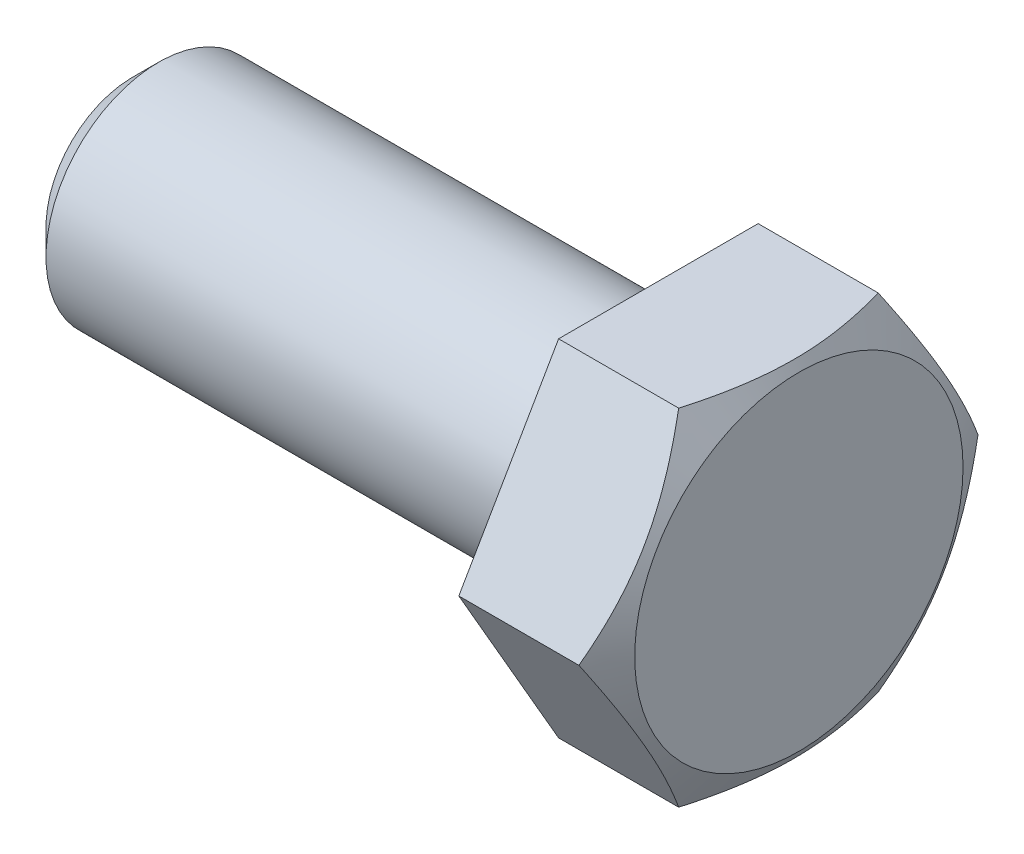
ISO-10303-21;
HEADER;
FILE_DESCRIPTION(('STEP AP214'),'2;1');
FILE_NAME('part.step','',(''),(''),'','','');
FILE_SCHEMA(('AUTOMOTIVE_DESIGN { 1 0 10303 214 1 1 1 1 }'));
ENDSEC;
DATA;
#1=APPLICATION_CONTEXT('core data for automotive mechanical design processes');
#2=APPLICATION_PROTOCOL_DEFINITION('international standard','automotive_design',2000,#1);
#3=PRODUCT_CONTEXT('',#1,'mechanical');
#4=PRODUCT('Part','Part','',(#3));
#5=PRODUCT_RELATED_PRODUCT_CATEGORY('part','',(#4));
#6=PRODUCT_DEFINITION_FORMATION('','',#4);
#7=PRODUCT_DEFINITION_CONTEXT('part definition',#1,'design');
#8=PRODUCT_DEFINITION('design','',#6,#7);
#9=PRODUCT_DEFINITION_SHAPE('','',#8);
#10=(LENGTH_UNIT() NAMED_UNIT(*) SI_UNIT(.MILLI.,.METRE.));
#11=(NAMED_UNIT(*) PLANE_ANGLE_UNIT() SI_UNIT($,.RADIAN.));
#12=(NAMED_UNIT(*) SI_UNIT($,.STERADIAN.) SOLID_ANGLE_UNIT());
#13=UNCERTAINTY_MEASURE_WITH_UNIT(LENGTH_MEASURE(1.E-05),#10,'distance_accuracy_value','');
#14=(GEOMETRIC_REPRESENTATION_CONTEXT(3) GLOBAL_UNCERTAINTY_ASSIGNED_CONTEXT((#13)) GLOBAL_UNIT_ASSIGNED_CONTEXT((#10,
#11,#12)) REPRESENTATION_CONTEXT('',''));
#15=CARTESIAN_POINT('',(0.,0.,0.));
#16=DIRECTION('',(0.,0.,1.));
#17=DIRECTION('',(1.,0.,0.));
#18=AXIS2_PLACEMENT_3D('',#15,#16,#17);
#19=CARTESIAN_POINT('',(18.7,-23.,-13.2790561913614));
#20=DIRECTION('',(0.,0.5,0.866025403784439));
#21=DIRECTION('',(0.,-0.866025403784439,0.5));
#22=AXIS2_PLACEMENT_3D('',#19,#20,#21);
#23=PLANE('',#22);
#24=DIRECTION('',(-1.,0.,0.));
#25=VECTOR('',#24,1.);
#26=CARTESIAN_POINT('',(18.7,0.,-26.5581123827228));
#27=LINE('',#26,#25);
#28=CARTESIAN_POINT('',(15.98177004846,0.,-26.5581123827228));
#29=VERTEX_POINT('',#28);
#30=CARTESIAN_POINT('',(0.,0.,-26.5581123827228));
#31=VERTEX_POINT('',#30);
#32=EDGE_CURVE('E102',#29,#31,#27,.T.);
#33=ORIENTED_EDGE('',*,*,#32,.F.);
#34=CARTESIAN_POINT('',(15.9817033813586,0.000200000000008834,-26.5582278527766));
#35=CARTESIAN_POINT('',(16.1502011985481,-0.505330062673204,-26.2663599350088));
#36=CARTESIAN_POINT('',(16.3110527987376,-1.01283196178729,-25.973353576941));
#37=CARTESIAN_POINT('',(16.6153381972535,-2.03190531689706,-25.3849913010444));
#38=CARTESIAN_POINT('',(16.7587662669133,-2.5434780527506,-25.0896346442893));
#39=CARTESIAN_POINT('',(17.0262794649299,-3.57169268257136,-24.4959946509776));
#40=CARTESIAN_POINT('',(17.150318401199,-4.08834365645311,-24.1977060721299));
#41=CARTESIAN_POINT('',(17.3763812476432,-5.12521364262296,-23.5990689065001));
#42=CARTESIAN_POINT('',(17.4784073509189,-5.64543229413633,-23.2987205280114));
#43=CARTESIAN_POINT('',(17.6561136735018,-6.67614041497859,-22.7036409169872));
#44=CARTESIAN_POINT('',(17.7323815673877,-7.18655343138033,-22.4089538245697));
#45=CARTESIAN_POINT('',(17.8602654373196,-8.20971821625924,-21.8182293605946));
#46=CARTESIAN_POINT('',(17.9118809388424,-8.72247002956312,-21.5221919631561));
#47=CARTESIAN_POINT('',(17.9891567585064,-9.74883498195347,-20.9296198816067));
#48=CARTESIAN_POINT('',(18.0148479188244,-10.262446367649,-20.6330862098166));
#49=CARTESIAN_POINT('',(18.0397225737895,-11.290143110363,-20.0397452187653));
#50=CARTESIAN_POINT('',(18.0389068875491,-11.8042284522445,-19.7429379082436));
#51=CARTESIAN_POINT('',(18.0126192180329,-12.7653194926008,-19.1880517373782));
#52=CARTESIAN_POINT('',(17.9903527841641,-13.2123936406372,-18.9299333576616));
#53=CARTESIAN_POINT('',(17.9261954988025,-14.1054746057766,-18.4143128220302));
#54=CARTESIAN_POINT('',(17.8843049283877,-14.551481438075,-18.1568106573424));
#55=CARTESIAN_POINT('',(17.7816253785011,-15.4422629858203,-17.6425176909625));
#56=CARTESIAN_POINT('',(17.7208193097279,-15.8870362186836,-17.3857277452405));
#57=CARTESIAN_POINT('',(17.5813849288372,-16.7744530307106,-16.8733774099333));
#58=CARTESIAN_POINT('',(17.502756692231,-17.2170966188894,-16.6178170151432));
#59=CARTESIAN_POINT('',(17.2381208571077,-18.5608682942346,-15.8419900766533));
#60=CARTESIAN_POINT('',(17.0257116981298,-19.4581784847056,-15.3239277966383));
#61=CARTESIAN_POINT('',(16.6640950700395,-20.7942343191446,-14.5525556009725));
#62=CARTESIAN_POINT('',(16.5365191724387,-21.2375518433277,-14.2966061090489));
#63=CARTESIAN_POINT('',(16.2684518903369,-22.1211205248807,-13.7864774929068));
#64=CARTESIAN_POINT('',(16.1279641460901,-22.5613725090964,-13.5322978913086));
#65=CARTESIAN_POINT('',(15.9817033813586,-23.0002,-13.2789407213076));
#66=B_SPLINE_CURVE_WITH_KNOTS('',3,(#34,#35,#36,#37,#38,#39,#40,#41,#42,#43,#44,#45,#46,#47,#48,
#49,#50,#51,#52,#53,#54,#55,#56,#57,#58,#59,#60,#61,#62,#63,#64,#65),.UNSPECIFIED.,.F.,.F.,(4,2,
2,2,2,2,2,2,2,2,2,2,2,2,2,4),(0.,1.82275209583971,3.64610187987773,5.47373144334343,
7.30117883905958,9.08355891739022,10.8659733025976,12.6462646412199,14.4265009654718,
15.9762768881921,17.5260306140232,19.0771885590146,20.6283399319781,23.7989683744784,
25.381520854309,26.9636285236953),.UNSPECIFIED.);
#67=CARTESIAN_POINT('',(15.98177004846,-23.,-13.2790561913614));
#68=VERTEX_POINT('',#67);
#69=EDGE_CURVE('E89',#29,#68,#66,.T.);
#70=ORIENTED_EDGE('',*,*,#69,.T.);
#71=DIRECTION('',(-1.,0.,0.));
#72=VECTOR('',#71,1.);
#73=CARTESIAN_POINT('',(18.7,-23.,-13.2790561913614));
#74=LINE('',#73,#72);
#75=CARTESIAN_POINT('',(0.,-23.,-13.2790561913614));
#76=VERTEX_POINT('',#75);
#77=EDGE_CURVE('E60',#68,#76,#74,.T.);
#78=ORIENTED_EDGE('',*,*,#77,.T.);
#79=DIRECTION('',(0.,0.866025403784439,-0.5));
#80=VECTOR('',#79,1.);
#81=CARTESIAN_POINT('',(0.,-23.,-13.2790561913614));
#82=LINE('',#81,#80);
#83=EDGE_CURVE('E108',#76,#31,#82,.T.);
#84=ORIENTED_EDGE('',*,*,#83,.T.);
#85=EDGE_LOOP('',(#33,#70,#78,#84));
#86=FACE_BOUND('',#85,.T.);
#87=ADVANCED_FACE('F37',(#86),#23,.F.);
#88=CARTESIAN_POINT('',(18.7,0.,-26.5581123827228));
#89=DIRECTION('',(0.,-0.5,0.866025403784439));
#90=DIRECTION('',(0.,-0.866025403784439,-0.5));
#91=AXIS2_PLACEMENT_3D('',#88,#89,#90);
#92=PLANE('',#91);
#93=DIRECTION('',(-1.,0.,0.));
#94=VECTOR('',#93,1.);
#95=CARTESIAN_POINT('',(18.7,23.,-13.2790561913614));
#96=LINE('',#95,#94);
#97=CARTESIAN_POINT('',(15.98177004846,23.,-13.2790561913614));
#98=VERTEX_POINT('',#97);
#99=CARTESIAN_POINT('',(0.,23.,-13.2790561913614));
#100=VERTEX_POINT('',#99);
#101=EDGE_CURVE('E104',#98,#100,#96,.T.);
#102=ORIENTED_EDGE('',*,*,#101,.F.);
#103=CARTESIAN_POINT('',(15.9817033813586,23.0002,-13.2789407213076));
#104=CARTESIAN_POINT('',(16.1502011985481,22.4946699373268,-13.5708086390754));
#105=CARTESIAN_POINT('',(16.3110527987376,21.9871680382127,-13.8638149971432));
#106=CARTESIAN_POINT('',(16.6153381972535,20.9680946831029,-14.4521772730398));
#107=CARTESIAN_POINT('',(16.7587662669133,20.4565219472494,-14.7475339297949));
#108=CARTESIAN_POINT('',(17.0262794649299,19.4283073174286,-15.3411739231066));
#109=CARTESIAN_POINT('',(17.150318401199,18.9116563435469,-15.6394625019543));
#110=CARTESIAN_POINT('',(17.3763812476432,17.874786357377,-16.2380996675841));
#111=CARTESIAN_POINT('',(17.4784073509189,17.3545677058637,-16.5384480460728));
#112=CARTESIAN_POINT('',(17.6561136735018,16.3238595850214,-17.133527657097));
#113=CARTESIAN_POINT('',(17.7323815673877,15.8134465686197,-17.4282147495145));
#114=CARTESIAN_POINT('',(17.8602654373196,14.7902817837408,-18.0189392134897));
#115=CARTESIAN_POINT('',(17.9118809388424,14.2775299704369,-18.3149766109281));
#116=CARTESIAN_POINT('',(17.9891567585064,13.2511650180465,-18.9075486924775));
#117=CARTESIAN_POINT('',(18.0148479188244,12.737553632351,-19.2040823642677));
#118=CARTESIAN_POINT('',(18.0397225737894,11.709856889637,-19.7974233553189));
#119=CARTESIAN_POINT('',(18.0389068875491,11.1957715477555,-20.0942306658406));
#120=CARTESIAN_POINT('',(18.0126192180329,10.2346805073992,-20.649116836706));
#121=CARTESIAN_POINT('',(17.9903527841641,9.78760635936283,-20.9072352164226));
#122=CARTESIAN_POINT('',(17.9261954988025,8.89452539422337,-21.422855752054));
#123=CARTESIAN_POINT('',(17.8843049283877,8.44851856192502,-21.6803579167418));
#124=CARTESIAN_POINT('',(17.7816253785011,7.5577370141797,-22.1946508831218));
#125=CARTESIAN_POINT('',(17.7208193097279,7.1129637813164,-22.4514408288437));
#126=CARTESIAN_POINT('',(17.5813849288372,6.22554696928939,-22.9637911641509));
#127=CARTESIAN_POINT('',(17.502756692231,5.78290338111064,-23.219351558941));
#128=CARTESIAN_POINT('',(17.2381208571076,4.43913170576542,-23.9951784974309));
#129=CARTESIAN_POINT('',(17.0257116981298,3.54182151529443,-24.513240777446));
#130=CARTESIAN_POINT('',(16.6640950700395,2.20576568085546,-25.2846129731117));
#131=CARTESIAN_POINT('',(16.5365191724387,1.76244815667234,-25.5405624650353));
#132=CARTESIAN_POINT('',(16.2684518903369,0.878879475119307,-26.0506910811774));
#133=CARTESIAN_POINT('',(16.1279641460901,0.438627490903595,-26.3048706827756));
#134=CARTESIAN_POINT('',(15.9817033813586,-0.000199999999991352,-26.5582278527766));
#135=B_SPLINE_CURVE_WITH_KNOTS('',3,(#103,#104,#105,#106,#107,#108,#109,#110,#111,#112,#113,
#114,#115,#116,#117,#118,#119,#120,#121,#122,#123,#124,#125,#126,#127,#128,#129,#130,#131,#132,
#133,#134),.UNSPECIFIED.,.F.,.F.,(4,2,2,2,2,2,2,2,2,2,2,2,2,2,2,4),(0.,1.82275209583971,
3.64610187987773,5.47373144334344,7.30117883905958,9.08355891739021,10.8659733025976,
12.6462646412199,14.4265009654718,15.9762768881921,17.5260306140232,19.0771885590146,
20.6283399319781,23.7989683744784,25.381520854309,26.9636285236953),.UNSPECIFIED.);
#136=EDGE_CURVE('E92',#98,#29,#135,.T.);
#137=ORIENTED_EDGE('',*,*,#136,.T.);
#138=ORIENTED_EDGE('',*,*,#32,.T.);
#139=DIRECTION('',(0.,0.866025403784438,0.5));
#140=VECTOR('',#139,1.);
#141=CARTESIAN_POINT('',(0.,0.,-26.5581123827228));
#142=LINE('',#141,#140);
#143=EDGE_CURVE('E131',#31,#100,#142,.T.);
#144=ORIENTED_EDGE('',*,*,#143,.T.);
#145=EDGE_LOOP('',(#102,#137,#138,#144));
#146=FACE_BOUND('',#145,.T.);
#147=ADVANCED_FACE('F100',(#146),#92,.F.);
#148=CARTESIAN_POINT('',(18.7,23.,-13.2790561913614));
#149=DIRECTION('',(0.,-1.,0.));
#150=DIRECTION('',(0.,0.,-1.));
#151=AXIS2_PLACEMENT_3D('',#148,#149,#150);
#152=PLANE('',#151);
#153=DIRECTION('',(-1.,0.,0.));
#154=VECTOR('',#153,1.);
#155=CARTESIAN_POINT('',(18.7,23.,13.2790561913614));
#156=LINE('',#155,#154);
#157=CARTESIAN_POINT('',(15.98177004846,23.,13.2790561913614));
#158=VERTEX_POINT('',#157);
#159=CARTESIAN_POINT('',(0.,23.,13.2790561913614));
#160=VERTEX_POINT('',#159);
#161=EDGE_CURVE('E111',#158,#160,#156,.T.);
#162=ORIENTED_EDGE('',*,*,#161,.F.);
#163=CARTESIAN_POINT('',(7.07439166605425,23.,-35.1260062269643));
#164=CARTESIAN_POINT('',(7.31808519038506,23.,-34.6214667244443));
#165=CARTESIAN_POINT('',(7.5605137491192,23.,-34.116314357186));
#166=CARTESIAN_POINT('',(8.04254214626597,23.,-33.1046552605516));
#167=CARTESIAN_POINT('',(8.28214195325279,23.,-32.5981485162058));
#168=CARTESIAN_POINT('',(8.75824943613874,23.,-31.5835762806856));
#169=CARTESIAN_POINT('',(8.99475657497651,23.,-31.0755105372085));
#170=CARTESIAN_POINT('',(9.46427584940225,23.,-30.0577694951503));
#171=CARTESIAN_POINT('',(9.69728799396989,23.,-29.5480942007086));
#172=CARTESIAN_POINT('',(10.3931661877172,23.,-28.0105312709745));
#173=CARTESIAN_POINT('',(10.8501195396296,23.,-26.979953395623));
#174=CARTESIAN_POINT('',(11.7442762938602,23.,-24.9103007042642));
#175=CARTESIAN_POINT('',(12.181480732735,23.,-23.8712263375991));
#176=CARTESIAN_POINT('',(13.0358825389817,23.,-21.7704504579267));
#177=CARTESIAN_POINT('',(13.4527810728399,23.,-20.7086267462517));
#178=CARTESIAN_POINT('',(14.2536979553438,23.,-18.572415460692));
#179=CARTESIAN_POINT('',(14.637712638227,23.,-17.4980265012166));
#180=CARTESIAN_POINT('',(15.3624708838141,23.,-15.3372480271595));
#181=CARTESIAN_POINT('',(15.7033072526952,23.,-14.2508899001616));
#182=CARTESIAN_POINT('',(16.3305965267326,23.,-12.0626288622898));
#183=CARTESIAN_POINT('',(16.6170667066952,23.,-10.9607310091094));
#184=CARTESIAN_POINT('',(16.9954702044003,23.,-9.29601346187074));
#185=CARTESIAN_POINT('',(17.1130770281649,23.,-8.7389906320123));
#186=CARTESIAN_POINT('',(17.3293210074896,23.,-7.62125639085807));
#187=CARTESIAN_POINT('',(17.4279585944305,23.,-7.06054506374262));
#188=CARTESIAN_POINT('',(17.6045101916899,23.,-5.9358169045642));
#189=CARTESIAN_POINT('',(17.6824229068822,23.,-5.37179986817274));
#190=CARTESIAN_POINT('',(17.8159568382735,23.,-4.24111394992035));
#191=CARTESIAN_POINT('',(17.8715780258803,23.,-3.67444506465897));
#192=CARTESIAN_POINT('',(17.9590364509718,23.,-2.54282548942751));
#193=CARTESIAN_POINT('',(17.9910201531806,23.,-1.97788619339113));
#194=CARTESIAN_POINT('',(18.031036841926,23.,-0.847162886914948));
#195=CARTESIAN_POINT('',(18.0390701873603,23.,-0.28137888926017));
#196=CARTESIAN_POINT('',(18.0309961658223,23.,0.849864513398281));
#197=CARTESIAN_POINT('',(18.0148953788774,23.,1.41532396484198));
#198=CARTESIAN_POINT('',(17.9589504878202,23.,2.54507106745939));
#199=CARTESIAN_POINT('',(17.9191053366815,23.,3.10935866585814));
#200=CARTESIAN_POINT('',(17.7943517575055,23.,4.47956459390397));
#201=CARTESIAN_POINT('',(17.6974054557474,23.,5.28440464320615));
#202=CARTESIAN_POINT('',(17.4606240084475,23.,6.88775937710742));
#203=CARTESIAN_POINT('',(17.3207824198766,23.,7.68627309297204));
#204=CARTESIAN_POINT('',(17.0029689246414,23.,9.27740159057656));
#205=CARTESIAN_POINT('',(16.8249151254118,23.,10.069999859334));
#206=CARTESIAN_POINT('',(16.4362015474096,23.,11.647052386795));
#207=CARTESIAN_POINT('',(16.2255430134296,23.,12.4315069551914));
#208=CARTESIAN_POINT('',(15.7714264081023,23.,14.0106174830527));
#209=CARTESIAN_POINT('',(15.5273184978228,23.,14.8050852920603));
#210=CARTESIAN_POINT('',(15.0149952176509,23.,16.3862378737503));
#211=CARTESIAN_POINT('',(14.746777685003,23.,17.1729219411508));
#212=CARTESIAN_POINT('',(14.1918932624338,23.,18.7347202643054));
#213=CARTESIAN_POINT('',(13.905339285181,23.,19.5098747904796));
#214=CARTESIAN_POINT('',(13.4631992043613,23.,20.6677298791923));
#215=CARTESIAN_POINT('',(13.3137924965904,23.,21.0528076945185));
#216=CARTESIAN_POINT('',(13.0112102769653,23.,21.8214679294351));
#217=CARTESIAN_POINT('',(12.8580348708078,23.,22.2050503906154));
#218=CARTESIAN_POINT('',(12.7031445594992,23.,22.5879400036462));
#219=B_SPLINE_CURVE_WITH_KNOTS('',3,(#163,#164,#165,#166,#167,#168,#169,#170,#171,#172,#173,
#174,#175,#176,#177,#178,#179,#180,#181,#182,#183,#184,#185,#186,#187,#188,#189,#190,#191,#192,
#193,#194,#195,#196,#197,#198,#199,#200,#201,#202,#203,#204,#205,#206,#207,#208,#209,#210,#211,
#212,#213,#214,#215,#216,#217,#218),.UNSPECIFIED.,.F.,.F.,(4,2,2,2,2,2,2,2,2,2,2,2,2,2,2,2,2,2,
2,2,2,2,2,2,2,2,2,4),(0.,1.68092887634073,3.36187640928819,5.04311207312404,6.72434341662828,
10.1061937352805,13.4878663448116,16.9096514517711,20.3318175106601,23.7464985545005,
27.1600927632658,28.86773041667,30.5753292319745,32.2830347324689,33.9907424233467,
35.6877778480517,37.3847878424318,39.0813352412881,40.7779574562769,43.2085755663555,
45.6395589430896,48.075805132942,50.5119583340505,53.004871161848,55.4980078401878,
57.977045341135,59.2161684454316,60.4552568368678),.UNSPECIFIED.);
#220=EDGE_CURVE('E105',#158,#98,#219,.F.);
#221=ORIENTED_EDGE('',*,*,#220,.T.);
#222=ORIENTED_EDGE('',*,*,#101,.T.);
#223=DIRECTION('',(0.,0.,1.));
#224=VECTOR('',#223,1.);
#225=CARTESIAN_POINT('',(0.,23.,-13.2790561913614));
#226=LINE('',#225,#224);
#227=EDGE_CURVE('E128',#100,#160,#226,.T.);
#228=ORIENTED_EDGE('',*,*,#227,.T.);
#229=EDGE_LOOP('',(#162,#221,#222,#228));
#230=FACE_BOUND('',#229,.T.);
#231=ADVANCED_FACE('F178',(#230),#152,.F.);
#232=CARTESIAN_POINT('',(18.7,23.,13.2790561913614));
#233=DIRECTION('',(0.,-0.5,-0.866025403784439));
#234=DIRECTION('',(0.,0.866025403784438,-0.5));
#235=AXIS2_PLACEMENT_3D('',#232,#233,#234);
#236=PLANE('',#235);
#237=DIRECTION('',(-1.,0.,0.));
#238=VECTOR('',#237,1.);
#239=CARTESIAN_POINT('',(18.7,0.,26.5581123827228));
#240=LINE('',#239,#238);
#241=CARTESIAN_POINT('',(15.98177004846,0.,26.5581123827228));
#242=VERTEX_POINT('',#241);
#243=CARTESIAN_POINT('',(0.,0.,26.5581123827228));
#244=VERTEX_POINT('',#243);
#245=EDGE_CURVE('E115',#242,#244,#240,.T.);
#246=ORIENTED_EDGE('',*,*,#245,.F.);
#247=CARTESIAN_POINT('',(15.9817033813586,-0.000199999999996708,26.5582278527766));
#248=CARTESIAN_POINT('',(16.1502011985481,0.505330062673217,26.2663599350088));
#249=CARTESIAN_POINT('',(16.3110527987376,1.01283196178731,25.973353576941));
#250=CARTESIAN_POINT('',(16.6153381972535,2.03190531689707,25.3849913010444));
#251=CARTESIAN_POINT('',(16.7587662669133,2.54347805275062,25.0896346442893));
#252=CARTESIAN_POINT('',(17.0262794649299,3.57169268257137,24.4959946509776));
#253=CARTESIAN_POINT('',(17.150318401199,4.08834365645312,24.1977060721299));
#254=CARTESIAN_POINT('',(17.3763812476432,5.12521364262297,23.5990689065001));
#255=CARTESIAN_POINT('',(17.4784073509189,5.64543229413634,23.2987205280114));
#256=CARTESIAN_POINT('',(17.6561136735018,6.67614041497859,22.7036409169871));
#257=CARTESIAN_POINT('',(17.7323815673877,7.18655343138033,22.4089538245697));
#258=CARTESIAN_POINT('',(17.8602654373196,8.20971821625924,21.8182293605945));
#259=CARTESIAN_POINT('',(17.9118809388424,8.72247002956312,21.5221919631561));
#260=CARTESIAN_POINT('',(17.9891567585064,9.74883498195347,20.9296198816067));
#261=CARTESIAN_POINT('',(18.0148479188244,10.262446367649,20.6330862098165));
#262=CARTESIAN_POINT('',(18.0397225737895,11.290143110363,20.0397452187653));
#263=CARTESIAN_POINT('',(18.0389068875491,11.8042284522445,19.7429379082436));
#264=CARTESIAN_POINT('',(18.0126192180329,12.7653194926008,19.1880517373782));
#265=CARTESIAN_POINT('',(17.9903527841641,13.2123936406372,18.9299333576616));
#266=CARTESIAN_POINT('',(17.9261954988025,14.1054746057766,18.4143128220302));
#267=CARTESIAN_POINT('',(17.8843049283877,14.551481438075,18.1568106573423));
#268=CARTESIAN_POINT('',(17.7816253785011,15.4422629858203,17.6425176909624));
#269=CARTESIAN_POINT('',(17.7208193097279,15.8870362186836,17.3857277452405));
#270=CARTESIAN_POINT('',(17.5813849288372,16.7744530307106,16.8733774099333));
#271=CARTESIAN_POINT('',(17.502756692231,17.2170966188894,16.6178170151432));
#272=CARTESIAN_POINT('',(17.2381208571077,18.5608682942346,15.8419900766533));
#273=CARTESIAN_POINT('',(17.0257116981298,19.4581784847056,15.3239277966382));
#274=CARTESIAN_POINT('',(16.6640950700395,20.7942343191446,14.5525556009725));
#275=CARTESIAN_POINT('',(16.5365191724387,21.2375518433277,14.2966061090489));
#276=CARTESIAN_POINT('',(16.2684518903369,22.1211205248807,13.7864774929067));
#277=CARTESIAN_POINT('',(16.1279641460901,22.5613725090964,13.5322978913085));
#278=CARTESIAN_POINT('',(15.9817033813586,23.0002,13.2789407213075));
#279=B_SPLINE_CURVE_WITH_KNOTS('',3,(#247,#248,#249,#250,#251,#252,#253,#254,#255,#256,#257,
#258,#259,#260,#261,#262,#263,#264,#265,#266,#267,#268,#269,#270,#271,#272,#273,#274,#275,#276,
#277,#278),.UNSPECIFIED.,.F.,.F.,(4,2,2,2,2,2,2,2,2,2,2,2,2,2,2,4),(0.,1.82275209583971,
3.64610187987773,5.47373144334343,7.30117883905957,9.08355891739021,10.8659733025976,
12.6462646412199,14.4265009654718,15.9762768881921,17.5260306140232,19.0771885590146,
20.6283399319781,23.7989683744784,25.381520854309,26.9636285236953),.UNSPECIFIED.);
#280=EDGE_CURVE('E169',#242,#158,#279,.T.);
#281=ORIENTED_EDGE('',*,*,#280,.T.);
#282=ORIENTED_EDGE('',*,*,#161,.T.);
#283=DIRECTION('',(0.,-0.866025403784438,0.5));
#284=VECTOR('',#283,1.);
#285=CARTESIAN_POINT('',(0.,23.,13.2790561913614));
#286=LINE('',#285,#284);
#287=EDGE_CURVE('E125',#160,#244,#286,.T.);
#288=ORIENTED_EDGE('',*,*,#287,.T.);
#289=EDGE_LOOP('',(#246,#281,#282,#288));
#290=FACE_BOUND('',#289,.T.);
#291=ADVANCED_FACE('F181',(#290),#236,.F.);
#292=CARTESIAN_POINT('',(18.7,0.,26.5581123827228));
#293=DIRECTION('',(0.,0.5,-0.866025403784439));
#294=DIRECTION('',(0.,0.866025403784439,0.5));
#295=AXIS2_PLACEMENT_3D('',#292,#293,#294);
#296=PLANE('',#295);
#297=DIRECTION('',(-1.,0.,0.));
#298=VECTOR('',#297,1.);
#299=CARTESIAN_POINT('',(18.7,-23.,13.2790561913614));
#300=LINE('',#299,#298);
#301=CARTESIAN_POINT('',(15.98177004846,-23.,13.2790561913614));
#302=VERTEX_POINT('',#301);
#303=CARTESIAN_POINT('',(0.,-23.,13.2790561913614));
#304=VERTEX_POINT('',#303);
#305=EDGE_CURVE('E117',#302,#304,#300,.T.);
#306=ORIENTED_EDGE('',*,*,#305,.F.);
#307=CARTESIAN_POINT('',(15.9817033813586,-23.0002,13.2789407213075));
#308=CARTESIAN_POINT('',(16.1502011985481,-22.4946699373268,13.5708086390754));
#309=CARTESIAN_POINT('',(16.3110527987376,-21.9871680382127,13.8638149971431));
#310=CARTESIAN_POINT('',(16.6153381972535,-20.9680946831029,14.4521772730397));
#311=CARTESIAN_POINT('',(16.7587662669133,-20.4565219472494,14.7475339297948));
#312=CARTESIAN_POINT('',(17.0262794649299,-19.4283073174286,15.3411739231066));
#313=CARTESIAN_POINT('',(17.150318401199,-18.9116563435469,15.6394625019543));
#314=CARTESIAN_POINT('',(17.3763812476432,-17.874786357377,16.2380996675841));
#315=CARTESIAN_POINT('',(17.4784073509189,-17.3545677058637,16.5384480460728));
#316=CARTESIAN_POINT('',(17.6561136735018,-16.3238595850214,17.133527657097));
#317=CARTESIAN_POINT('',(17.7323815673877,-15.8134465686197,17.4282147495144));
#318=CARTESIAN_POINT('',(17.8602654373196,-14.7902817837408,18.0189392134896));
#319=CARTESIAN_POINT('',(17.9118809388424,-14.2775299704369,18.3149766109281));
#320=CARTESIAN_POINT('',(17.9891567585064,-13.2511650180465,18.9075486924775));
#321=CARTESIAN_POINT('',(18.0148479188244,-12.737553632351,19.2040823642676));
#322=CARTESIAN_POINT('',(18.0397225737895,-11.709856889637,19.7974233553189));
#323=CARTESIAN_POINT('',(18.0389068875491,-11.1957715477555,20.0942306658406));
#324=CARTESIAN_POINT('',(18.0126192180329,-10.2346805073992,20.649116836706));
#325=CARTESIAN_POINT('',(17.9903527841641,-9.78760635936284,20.9072352164225));
#326=CARTESIAN_POINT('',(17.9261954988025,-8.89452539422338,21.4228557520539));
#327=CARTESIAN_POINT('',(17.8843049283877,-8.44851856192502,21.6803579167418));
#328=CARTESIAN_POINT('',(17.7816253785011,-7.55773701417971,22.1946508831217));
#329=CARTESIAN_POINT('',(17.7208193097279,-7.1129637813164,22.4514408288437));
#330=CARTESIAN_POINT('',(17.5813849288372,-6.22554696928939,22.9637911641509));
#331=CARTESIAN_POINT('',(17.502756692231,-5.78290338111064,23.219351558941));
#332=CARTESIAN_POINT('',(17.2381208571077,-4.43913170576542,23.9951784974309));
#333=CARTESIAN_POINT('',(17.0257116981298,-3.54182151529442,24.5132407774459));
#334=CARTESIAN_POINT('',(16.6640950700395,-2.20576568085544,25.2846129731116));
#335=CARTESIAN_POINT('',(16.5365191724387,-1.76244815667233,25.5405624650352));
#336=CARTESIAN_POINT('',(16.2684518903369,-0.878879475119297,26.0506910811774));
#337=CARTESIAN_POINT('',(16.1279641460901,-0.438627490903586,26.3048706827756));
#338=CARTESIAN_POINT('',(15.9817033813586,0.000200000000002151,26.5582278527766));
#339=B_SPLINE_CURVE_WITH_KNOTS('',3,(#307,#308,#309,#310,#311,#312,#313,#314,#315,#316,#317,
#318,#319,#320,#321,#322,#323,#324,#325,#326,#327,#328,#329,#330,#331,#332,#333,#334,#335,#336,
#337,#338),.UNSPECIFIED.,.F.,.F.,(4,2,2,2,2,2,2,2,2,2,2,2,2,2,2,4),(0.,1.8227520958397,
3.64610187987772,5.47373144334343,7.30117883905957,9.08355891739021,10.8659733025976,
12.6462646412199,14.4265009654718,15.9762768881921,17.5260306140232,19.0771885590146,
20.6283399319781,23.7989683744784,25.381520854309,26.9636285236953),.UNSPECIFIED.);
#340=EDGE_CURVE('E52',#302,#242,#339,.T.);
#341=ORIENTED_EDGE('',*,*,#340,.T.);
#342=ORIENTED_EDGE('',*,*,#245,.T.);
#343=DIRECTION('',(0.,-0.866025403784438,-0.5));
#344=VECTOR('',#343,1.);
#345=CARTESIAN_POINT('',(0.,0.,26.5581123827228));
#346=LINE('',#345,#344);
#347=EDGE_CURVE('E122',#244,#304,#346,.T.);
#348=ORIENTED_EDGE('',*,*,#347,.T.);
#349=EDGE_LOOP('',(#306,#341,#342,#348));
#350=FACE_BOUND('',#349,.T.);
#351=ADVANCED_FACE('F215',(#350),#296,.F.);
#352=CARTESIAN_POINT('',(18.7,-23.,13.2790561913614));
#353=DIRECTION('',(0.,1.,0.));
#354=DIRECTION('',(0.,0.,1.));
#355=AXIS2_PLACEMENT_3D('',#352,#353,#354);
#356=PLANE('',#355);
#357=ORIENTED_EDGE('',*,*,#77,.F.);
#358=CARTESIAN_POINT('',(7.0743916660499,-23.,-35.1260062269733));
#359=CARTESIAN_POINT('',(7.3180851903808,-23.,-34.6214667244532));
#360=CARTESIAN_POINT('',(7.56051374911503,-23.,-34.1163143571947));
#361=CARTESIAN_POINT('',(8.04254214626198,-23.,-33.10465526056));
#362=CARTESIAN_POINT('',(8.28214195324891,-23.,-32.5981485162141));
#363=CARTESIAN_POINT('',(8.75824943613504,-23.,-31.5835762806935));
#364=CARTESIAN_POINT('',(8.9947565749729,-23.,-31.0755105372163));
#365=CARTESIAN_POINT('',(9.46427584939882,-23.,-30.0577694951577));
#366=CARTESIAN_POINT('',(9.69728799396655,-23.,-29.5480942007159));
#367=CARTESIAN_POINT('',(10.3931661877142,-23.,-28.0105312709814));
#368=CARTESIAN_POINT('',(10.8501195396267,-23.,-26.9799533956295));
#369=CARTESIAN_POINT('',(11.7442762938577,-23.,-24.9103007042701));
#370=CARTESIAN_POINT('',(12.1814807327326,-23.,-23.8712263376047));
#371=CARTESIAN_POINT('',(13.0358825389797,-23.,-21.7704504579316));
#372=CARTESIAN_POINT('',(13.4527810728381,-23.,-20.7086267462563));
#373=CARTESIAN_POINT('',(14.2536979553424,-23.,-18.572415460696));
#374=CARTESIAN_POINT('',(14.6377126382258,-23.,-17.4980265012202));
#375=CARTESIAN_POINT('',(15.3624708838131,-23.,-15.3372480271624));
#376=CARTESIAN_POINT('',(15.7033072526944,-23.,-14.2508899001643));
#377=CARTESIAN_POINT('',(16.3305965267321,-23.,-12.0626288622917));
#378=CARTESIAN_POINT('',(16.6170667066948,-23.,-10.960731009111));
#379=CARTESIAN_POINT('',(16.9954702044001,-23.,-9.29601346187171));
#380=CARTESIAN_POINT('',(17.1130770281647,-23.,-8.738990632013));
#381=CARTESIAN_POINT('',(17.3293210074896,-23.,-7.62125639085823));
#382=CARTESIAN_POINT('',(17.4279585944305,-23.,-7.06054506374251));
#383=CARTESIAN_POINT('',(17.60451019169,-23.,-5.93581690456354));
#384=CARTESIAN_POINT('',(17.6824229068823,-23.,-5.37179986817181));
#385=CARTESIAN_POINT('',(17.8159568382737,-23.,-4.24111394991887));
#386=CARTESIAN_POINT('',(17.8715780258805,-23.,-3.67444506465721));
#387=CARTESIAN_POINT('',(17.9590364509719,-23.,-2.5428254894252));
#388=CARTESIAN_POINT('',(17.9910201531808,-23.,-1.97788619338855));
#389=CARTESIAN_POINT('',(18.0310368419261,-23.,-0.847162886911813));
#390=CARTESIAN_POINT('',(18.0390701873604,-23.,-0.28137888925676));
#391=CARTESIAN_POINT('',(18.0309961658222,-23.,0.849864513402237));
#392=CARTESIAN_POINT('',(18.0148953788772,-23.,1.41532396484621));
#393=CARTESIAN_POINT('',(17.95895048782,-23.,2.54507106746415));
#394=CARTESIAN_POINT('',(17.9191053366811,-23.,3.10935866586317));
#395=CARTESIAN_POINT('',(17.7943517575049,-23.,4.47956459390943));
#396=CARTESIAN_POINT('',(17.6974054557467,-23.,5.28440464321177));
#397=CARTESIAN_POINT('',(17.4606240084465,-23.,6.88775937711334));
#398=CARTESIAN_POINT('',(17.3207824198755,-23.,7.68627309297812));
#399=CARTESIAN_POINT('',(17.00296892464,-23.,9.27740159058294));
#400=CARTESIAN_POINT('',(16.8249151254102,-23.,10.0699998593405));
#401=CARTESIAN_POINT('',(16.4362015474078,-23.,11.6470523868018));
#402=CARTESIAN_POINT('',(16.2255430134277,-23.,12.4315069551984));
#403=CARTESIAN_POINT('',(15.7714264081001,-23.,14.0106174830599));
#404=CARTESIAN_POINT('',(15.5273184978205,-23.,14.8050852920677));
#405=CARTESIAN_POINT('',(15.0149952176484,-23.,16.386237873758));
#406=CARTESIAN_POINT('',(14.7467776850003,-23.,17.1729219411586));
#407=CARTESIAN_POINT('',(14.1918932624309,-23.,18.7347202643135));
#408=CARTESIAN_POINT('',(13.9053392851779,-23.,19.5098747904878));
#409=CARTESIAN_POINT('',(13.463199204358,-23.,20.6677298792008));
#410=CARTESIAN_POINT('',(13.3137924965871,-23.,21.052807694527));
#411=CARTESIAN_POINT('',(13.0112102769619,-23.,21.8214679294437));
#412=CARTESIAN_POINT('',(12.8580348708043,-23.,22.2050503906242));
#413=CARTESIAN_POINT('',(12.7031445594957,-23.,22.587940003655));
#414=B_SPLINE_CURVE_WITH_KNOTS('',3,(#358,#359,#360,#361,#362,#363,#364,#365,#366,#367,#368,
#369,#370,#371,#372,#373,#374,#375,#376,#377,#378,#379,#380,#381,#382,#383,#384,#385,#386,#387,
#388,#389,#390,#391,#392,#393,#394,#395,#396,#397,#398,#399,#400,#401,#402,#403,#404,#405,#406,
#407,#408,#409,#410,#411,#412,#413),.UNSPECIFIED.,.F.,.F.,(4,2,2,2,2,2,2,2,2,2,2,2,2,2,2,2,2,2,
2,2,2,2,2,2,2,2,2,4),(0.,1.68092887634126,3.36187640928926,5.04311207312564,6.72434341663042,
10.1061937352837,13.4878663448159,16.9096514517765,20.3318175106666,23.7464985545082,
27.1600927632746,28.8677304166796,30.5753292319849,32.2830347324801,33.9907424233587,
35.6877778480646,37.3847878424455,39.0813352413026,40.7779574562922,43.2085755663713,
45.639558943106,48.0758051329588,50.5119583340679,53.0048711618659,55.4980078402063,
57.9770453411539,59.2161684454508,60.4552568368873),.UNSPECIFIED.);
#415=EDGE_CURVE('E94',#68,#302,#414,.T.);
#416=ORIENTED_EDGE('',*,*,#415,.T.);
#417=ORIENTED_EDGE('',*,*,#305,.T.);
#418=DIRECTION('',(0.,0.,-1.));
#419=VECTOR('',#418,1.);
#420=CARTESIAN_POINT('',(0.,-23.,13.2790561913614));
#421=LINE('',#420,#419);
#422=EDGE_CURVE('E120',#304,#76,#421,.T.);
#423=ORIENTED_EDGE('',*,*,#422,.T.);
#424=EDGE_LOOP('',(#357,#416,#417,#423));
#425=FACE_BOUND('',#424,.T.);
#426=ADVANCED_FACE('F224',(#425),#356,.F.);
#427=CARTESIAN_POINT('',(0.,-23.,-13.2790561913614));
#428=DIRECTION('',(-1.,0.,0.));
#429=DIRECTION('',(0.,0.,1.));
#430=AXIS2_PLACEMENT_3D('',#427,#428,#429);
#431=PLANE('',#430);
#432=CARTESIAN_POINT('',(0.,0.,0.));
#433=DIRECTION('',(-1.,0.,0.));
#434=DIRECTION('',(0.,0.,1.));
#435=AXIS2_PLACEMENT_3D('',#432,#433,#434);
#436=CIRCLE('',#435,15.);
#437=CARTESIAN_POINT('',(0.,0.,15.));
#438=VERTEX_POINT('',#437);
#439=EDGE_CURVE('E96',#438,#438,#436,.T.);
#440=ORIENTED_EDGE('',*,*,#439,.F.);
#441=EDGE_LOOP('',(#440));
#442=FACE_BOUND('',#441,.T.);
#443=ORIENTED_EDGE('',*,*,#83,.F.);
#444=ORIENTED_EDGE('',*,*,#422,.F.);
#445=ORIENTED_EDGE('',*,*,#347,.F.);
#446=ORIENTED_EDGE('',*,*,#287,.F.);
#447=ORIENTED_EDGE('',*,*,#227,.F.);
#448=ORIENTED_EDGE('',*,*,#143,.F.);
#449=EDGE_LOOP('',(#443,#444,#445,#446,#447,#448));
#450=FACE_BOUND('',#449,.T.);
#451=ADVANCED_FACE('F233',(#442,#450),#431,.T.);
#452=CARTESIAN_POINT('',(-70.,0.,0.));
#453=DIRECTION('',(1.,0.,0.));
#454=DIRECTION('',(0.,0.,-1.));
#455=AXIS2_PLACEMENT_3D('',#452,#453,#454);
#456=CYLINDRICAL_SURFACE('',#455,15.);
#457=CARTESIAN_POINT('',(-66.5,0.,0.));
#458=DIRECTION('',(-1.,0.,0.));
#459=DIRECTION('',(0.,0.,1.));
#460=AXIS2_PLACEMENT_3D('',#457,#458,#459);
#461=CIRCLE('',#460,15.);
#462=CARTESIAN_POINT('',(-66.5,0.,-15.));
#463=VERTEX_POINT('',#462);
#464=EDGE_CURVE('E11',#463,#463,#461,.F.);
#465=ORIENTED_EDGE('',*,*,#464,.T.);
#466=EDGE_LOOP('',(#465));
#467=FACE_BOUND('',#466,.T.);
#468=ORIENTED_EDGE('',*,*,#439,.T.);
#469=EDGE_LOOP('',(#468));
#470=FACE_BOUND('',#469,.T.);
#471=ADVANCED_FACE('F262',(#467,#470),#456,.T.);
#472=CARTESIAN_POINT('',(-70.,0.,0.));
#473=DIRECTION('',(-1.,0.,0.));
#474=DIRECTION('',(0.,0.,1.));
#475=AXIS2_PLACEMENT_3D('',#472,#473,#474);
#476=PLANE('',#475);
#477=CARTESIAN_POINT('',(-70.,0.,0.));
#478=DIRECTION('',(-1.,0.,0.));
#479=DIRECTION('',(0.,0.,1.));
#480=AXIS2_PLACEMENT_3D('',#477,#478,#479);
#481=CIRCLE('',#480,11.5);
#482=CARTESIAN_POINT('',(-70.,0.,-11.5));
#483=VERTEX_POINT('',#482);
#484=EDGE_CURVE('E45',#483,#483,#481,.T.);
#485=ORIENTED_EDGE('',*,*,#484,.T.);
#486=EDGE_LOOP('',(#485));
#487=FACE_BOUND('',#486,.T.);
#488=ADVANCED_FACE('F150',(#487),#476,.T.);
#489=CARTESIAN_POINT('',(-70.,0.,0.));
#490=DIRECTION('',(1.,0.,0.));
#491=DIRECTION('',(0.,0.,-1.));
#492=AXIS2_PLACEMENT_3D('',#489,#490,#491);
#493=CONICAL_SURFACE('',#492,11.5,0.785398163397447);
#494=CARTESIAN_POINT('',(-66.5,0.,-15.));
#495=CARTESIAN_POINT('',(-66.5364583333333,0.,-14.9635416666667));
#496=CARTESIAN_POINT('',(-66.5729166666666,0.,-14.9270833333333));
#497=CARTESIAN_POINT('',(-66.6458333333333,0.,-14.8541666666667));
#498=CARTESIAN_POINT('',(-66.6822916666666,0.,-14.8177083333333));
#499=CARTESIAN_POINT('',(-66.7552083333333,0.,-14.7447916666667));
#500=CARTESIAN_POINT('',(-66.7916666666667,0.,-14.7083333333333));
#501=CARTESIAN_POINT('',(-66.8645833333333,0.,-14.6354166666667));
#502=CARTESIAN_POINT('',(-66.9010416666666,0.,-14.5989583333333));
#503=CARTESIAN_POINT('',(-66.9739583333333,0.,-14.5260416666667));
#504=CARTESIAN_POINT('',(-67.0104166666667,0.,-14.4895833333333));
#505=CARTESIAN_POINT('',(-67.0833333333333,0.,-14.4166666666667));
#506=CARTESIAN_POINT('',(-67.1197916666667,0.,-14.3802083333333));
#507=CARTESIAN_POINT('',(-67.1927083333333,0.,-14.3072916666667));
#508=CARTESIAN_POINT('',(-67.2291666666666,0.,-14.2708333333333));
#509=CARTESIAN_POINT('',(-67.3020833333333,0.,-14.1979166666667));
#510=CARTESIAN_POINT('',(-67.3385416666667,0.,-14.1614583333333));
#511=CARTESIAN_POINT('',(-67.4114583333333,0.,-14.0885416666667));
#512=CARTESIAN_POINT('',(-67.4479166666666,0.,-14.0520833333333));
#513=CARTESIAN_POINT('',(-67.5208333333333,0.,-13.9791666666667));
#514=CARTESIAN_POINT('',(-67.5572916666667,0.,-13.9427083333333));
#515=CARTESIAN_POINT('',(-67.6302083333333,0.,-13.8697916666667));
#516=CARTESIAN_POINT('',(-67.6666666666667,0.,-13.8333333333333));
#517=CARTESIAN_POINT('',(-67.7395833333333,0.,-13.7604166666667));
#518=CARTESIAN_POINT('',(-67.7760416666666,0.,-13.7239583333333));
#519=CARTESIAN_POINT('',(-67.8489583333333,0.,-13.6510416666667));
#520=CARTESIAN_POINT('',(-67.8854166666667,0.,-13.6145833333333));
#521=CARTESIAN_POINT('',(-67.9583333333333,0.,-13.5416666666667));
#522=CARTESIAN_POINT('',(-67.9947916666667,0.,-13.5052083333333));
#523=CARTESIAN_POINT('',(-68.0677083333333,0.,-13.4322916666667));
#524=CARTESIAN_POINT('',(-68.1041666666667,0.,-13.3958333333333));
#525=CARTESIAN_POINT('',(-68.1770833333333,0.,-13.3229166666667));
#526=CARTESIAN_POINT('',(-68.2135416666667,0.,-13.2864583333333));
#527=CARTESIAN_POINT('',(-68.2864583333333,0.,-13.2135416666667));
#528=CARTESIAN_POINT('',(-68.3229166666666,0.,-13.1770833333333));
#529=CARTESIAN_POINT('',(-68.3958333333333,0.,-13.1041666666667));
#530=CARTESIAN_POINT('',(-68.4322916666667,0.,-13.0677083333333));
#531=CARTESIAN_POINT('',(-68.5052083333333,0.,-12.9947916666667));
#532=CARTESIAN_POINT('',(-68.5416666666667,0.,-12.9583333333333));
#533=CARTESIAN_POINT('',(-68.6145833333333,0.,-12.8854166666667));
#534=CARTESIAN_POINT('',(-68.6510416666667,0.,-12.8489583333333));
#535=CARTESIAN_POINT('',(-68.7239583333333,0.,-12.7760416666667));
#536=CARTESIAN_POINT('',(-68.7604166666667,0.,-12.7395833333333));
#537=CARTESIAN_POINT('',(-68.8333333333333,0.,-12.6666666666667));
#538=CARTESIAN_POINT('',(-68.8697916666667,0.,-12.6302083333333));
#539=CARTESIAN_POINT('',(-68.9427083333333,0.,-12.5572916666667));
#540=CARTESIAN_POINT('',(-68.9791666666667,0.,-12.5208333333333));
#541=CARTESIAN_POINT('',(-69.0520833333333,0.,-12.4479166666667));
#542=CARTESIAN_POINT('',(-69.0885416666667,0.,-12.4114583333333));
#543=CARTESIAN_POINT('',(-69.1614583333333,0.,-12.3385416666667));
#544=CARTESIAN_POINT('',(-69.1979166666667,0.,-12.3020833333333));
#545=CARTESIAN_POINT('',(-69.2708333333333,0.,-12.2291666666667));
#546=CARTESIAN_POINT('',(-69.3072916666667,0.,-12.1927083333333));
#547=CARTESIAN_POINT('',(-69.3802083333333,0.,-12.1197916666667));
#548=CARTESIAN_POINT('',(-69.4166666666667,0.,-12.0833333333333));
#549=CARTESIAN_POINT('',(-69.4895833333333,0.,-12.0104166666667));
#550=CARTESIAN_POINT('',(-69.5260416666667,0.,-11.9739583333333));
#551=CARTESIAN_POINT('',(-69.5989583333333,0.,-11.9010416666667));
#552=CARTESIAN_POINT('',(-69.6354166666667,0.,-11.8645833333333));
#553=CARTESIAN_POINT('',(-69.7083333333333,0.,-11.7916666666667));
#554=CARTESIAN_POINT('',(-69.7447916666667,0.,-11.7552083333333));
#555=CARTESIAN_POINT('',(-69.8177083333333,0.,-11.6822916666667));
#556=CARTESIAN_POINT('',(-69.8541666666667,0.,-11.6458333333333));
#557=CARTESIAN_POINT('',(-69.9270833333333,0.,-11.5729166666667));
#558=CARTESIAN_POINT('',(-69.9635416666667,0.,-11.5364583333333));
#559=CARTESIAN_POINT('',(-70.,0.,-11.5));
#560=B_SPLINE_CURVE_WITH_KNOTS('',3,(#494,#495,#496,#497,#498,#499,#500,#501,#502,#503,#504,
#505,#506,#507,#508,#509,#510,#511,#512,#513,#514,#515,#516,#517,#518,#519,#520,#521,#522,#523,
#524,#525,#526,#527,#528,#529,#530,#531,#532,#533,#534,#535,#536,#537,#538,#539,#540,#541,#542,
#543,#544,#545,#546,#547,#548,#549,#550,#551,#552,#553,#554,#555,#556,#557,#558,#559),
.UNSPECIFIED.,.F.,.F.,(4,2,2,2,2,2,2,2,2,2,2,2,2,2,2,2,2,2,2,2,2,2,2,2,2,2,2,2,2,2,2,2,4),(0.,
0.154679608384554,0.309359216769107,0.464038825153671,0.618718433538225,0.773398041922788,
0.928077650307342,1.0827572586919,1.23743686707646,1.39211647546101,1.54679608384558,
1.70147569223013,1.85615530061469,2.01083490899925,2.1655145173838,2.32019412576837,
2.47487373415292,2.62955334253747,2.78423295092204,2.93891255930659,3.09359216769115,
3.24827177607571,3.40295138446026,3.55763099284483,3.71231060122938,3.86699020961394,
4.0216698179985,4.17634942638305,4.33102903476762,4.48570864315217,4.64038825153673,
4.79506785992129,4.94974746830585),.UNSPECIFIED.);
#561=EDGE_CURVE('BSEAM39',#463,#483,#560,.T.);
#562=ORIENTED_EDGE('',*,*,#464,.F.);
#563=ORIENTED_EDGE('',*,*,#484,.F.);
#564=ORIENTED_EDGE('',*,*,#561,.T.);
#565=ORIENTED_EDGE('',*,*,#561,.F.);
#566=EDGE_LOOP('',(#562,#564,#563,#565));
#567=FACE_BOUND('',#566,.T.);
#568=ADVANCED_FACE('F39',(#567),#493,.T.);
#569=CARTESIAN_POINT('',(15.98177004846,0.,0.));
#570=DIRECTION('',(-1.,0.,0.));
#571=DIRECTION('',(0.,0.,1.));
#572=AXIS2_PLACEMENT_3D('',#569,#570,#571);
#573=CONICAL_SURFACE('',#572,26.5581123827228,1.0471975511966);
#574=CARTESIAN_POINT('',(18.7,0.,0.));
#575=DIRECTION('',(1.,0.,0.));
#576=DIRECTION('',(0.,0.,-1.));
#577=AXIS2_PLACEMENT_3D('',#574,#575,#576);
#578=CIRCLE('',#577,21.85);
#579=CARTESIAN_POINT('',(18.7,0.,-21.85));
#580=VERTEX_POINT('',#579);
#581=EDGE_CURVE('E295',#580,#580,#578,.T.);
#582=ORIENTED_EDGE('',*,*,#581,.F.);
#583=EDGE_LOOP('',(#582));
#584=FACE_BOUND('',#583,.T.);
#585=ORIENTED_EDGE('',*,*,#136,.F.);
#586=ORIENTED_EDGE('',*,*,#220,.F.);
#587=ORIENTED_EDGE('',*,*,#280,.F.);
#588=ORIENTED_EDGE('',*,*,#340,.F.);
#589=ORIENTED_EDGE('',*,*,#415,.F.);
#590=ORIENTED_EDGE('',*,*,#69,.F.);
#591=EDGE_LOOP('',(#585,#586,#587,#588,#589,#590));
#592=FACE_BOUND('',#591,.T.);
#593=ADVANCED_FACE('F91',(#584,#592),#573,.T.);
#594=CARTESIAN_POINT('',(18.7,-23.,-13.2790561913614));
#595=DIRECTION('',(-1.,0.,0.));
#596=DIRECTION('',(0.,0.,1.));
#597=AXIS2_PLACEMENT_3D('',#594,#595,#596);
#598=PLANE('',#597);
#599=ORIENTED_EDGE('',*,*,#581,.T.);
#600=EDGE_LOOP('',(#599));
#601=FACE_BOUND('',#600,.T.);
#602=ADVANCED_FACE('F148',(#601),#598,.F.);
#603=CLOSED_SHELL('',(#87,#147,#231,#291,#351,#426,#451,#471,#488,#568,#593,#602));
#604=MANIFOLD_SOLID_BREP('B2',#603);
#605=ADVANCED_BREP_SHAPE_REPRESENTATION('',(#18,#604),#14);
#606=SHAPE_DEFINITION_REPRESENTATION(#9,#605);
ENDSEC;
END-ISO-10303-21;
